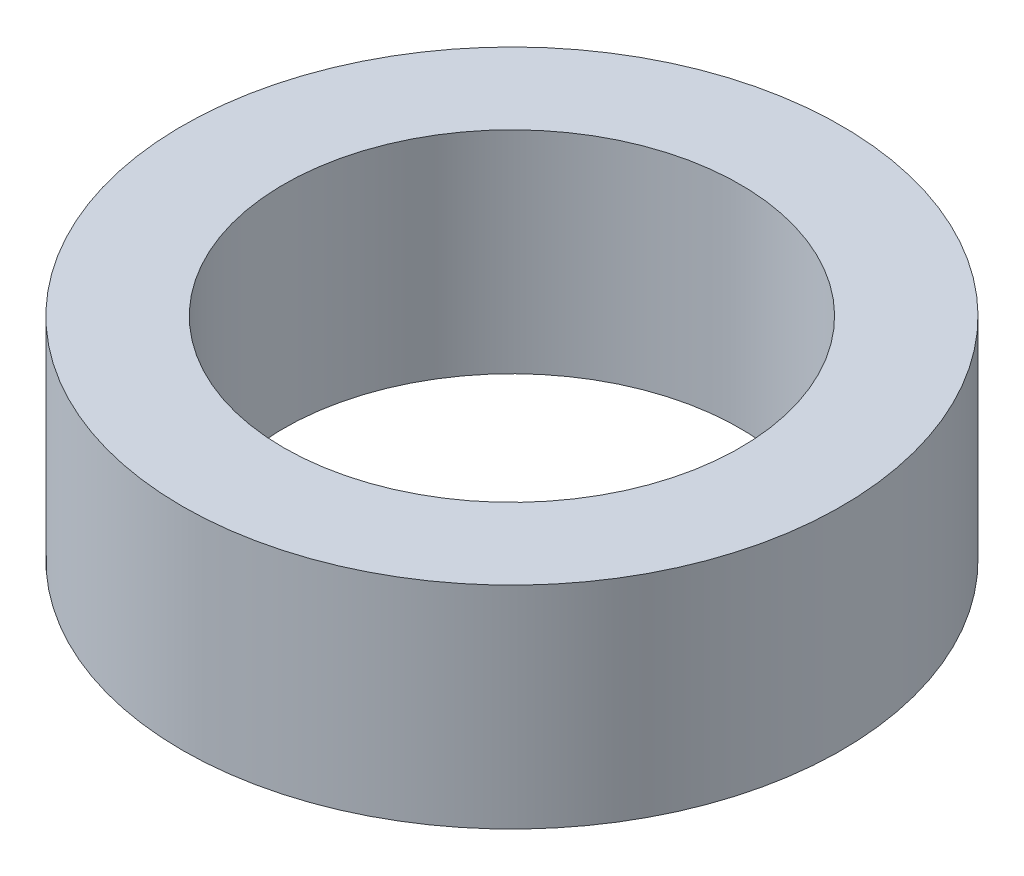
ISO-10303-21;
HEADER;
FILE_DESCRIPTION(('STEP AP214'),'2;1');
FILE_NAME('part.step','',(''),(''),'','','');
FILE_SCHEMA(('AUTOMOTIVE_DESIGN { 1 0 10303 214 1 1 1 1 }'));
ENDSEC;
DATA;
#1=APPLICATION_CONTEXT('core data for automotive mechanical design processes');
#2=APPLICATION_PROTOCOL_DEFINITION('international standard','automotive_design',2000,#1);
#3=PRODUCT_CONTEXT('',#1,'mechanical');
#4=PRODUCT('Part','Part','',(#3));
#5=PRODUCT_RELATED_PRODUCT_CATEGORY('part','',(#4));
#6=PRODUCT_DEFINITION_FORMATION('','',#4);
#7=PRODUCT_DEFINITION_CONTEXT('part definition',#1,'design');
#8=PRODUCT_DEFINITION('design','',#6,#7);
#9=PRODUCT_DEFINITION_SHAPE('','',#8);
#10=(LENGTH_UNIT() NAMED_UNIT(*) SI_UNIT(.MILLI.,.METRE.));
#11=(NAMED_UNIT(*) PLANE_ANGLE_UNIT() SI_UNIT($,.RADIAN.));
#12=(NAMED_UNIT(*) SI_UNIT($,.STERADIAN.) SOLID_ANGLE_UNIT());
#13=UNCERTAINTY_MEASURE_WITH_UNIT(LENGTH_MEASURE(1.E-05),#10,'distance_accuracy_value','');
#14=(GEOMETRIC_REPRESENTATION_CONTEXT(3) GLOBAL_UNCERTAINTY_ASSIGNED_CONTEXT((#13)) GLOBAL_UNIT_ASSIGNED_CONTEXT((#10,
#11,#12)) REPRESENTATION_CONTEXT('',''));
#15=CARTESIAN_POINT('',(0.,0.,0.));
#16=DIRECTION('',(0.,0.,1.));
#17=DIRECTION('',(1.,0.,0.));
#18=AXIS2_PLACEMENT_3D('',#15,#16,#17);
#19=CARTESIAN_POINT('',(0.,20.,0.));
#20=DIRECTION('',(0.,1.,0.));
#21=DIRECTION('',(0.,0.,1.));
#22=AXIS2_PLACEMENT_3D('',#19,#20,#21);
#23=PLANE('',#22);
#24=CARTESIAN_POINT('',(0.,20.,0.));
#25=DIRECTION('',(0.,1.,0.));
#26=DIRECTION('',(0.,0.,1.));
#27=AXIS2_PLACEMENT_3D('',#24,#25,#26);
#28=CIRCLE('',#27,31.2);
#29=CARTESIAN_POINT('',(0.,20.,31.2));
#30=VERTEX_POINT('',#29);
#31=EDGE_CURVE('E10',#30,#30,#28,.T.);
#32=ORIENTED_EDGE('',*,*,#31,.T.);
#33=EDGE_LOOP('',(#32));
#34=FACE_BOUND('',#33,.T.);
#35=CARTESIAN_POINT('',(0.,20.,0.));
#36=DIRECTION('',(0.,1.,0.));
#37=DIRECTION('',(0.,0.,1.));
#38=AXIS2_PLACEMENT_3D('',#35,#36,#37);
#39=CIRCLE('',#38,21.6);
#40=CARTESIAN_POINT('',(0.,20.,21.6));
#41=VERTEX_POINT('',#40);
#42=EDGE_CURVE('E50',#41,#41,#39,.T.);
#43=ORIENTED_EDGE('',*,*,#42,.F.);
#44=EDGE_LOOP('',(#43));
#45=FACE_BOUND('',#44,.T.);
#46=ADVANCED_FACE('F39',(#34,#45),#23,.T.);
#47=CARTESIAN_POINT('',(0.,0.,0.));
#48=DIRECTION('',(0.,1.,0.));
#49=DIRECTION('',(0.,0.,1.));
#50=AXIS2_PLACEMENT_3D('',#47,#48,#49);
#51=PLANE('',#50);
#52=CARTESIAN_POINT('',(0.,0.,0.));
#53=DIRECTION('',(0.,1.,0.));
#54=DIRECTION('',(0.,0.,1.));
#55=AXIS2_PLACEMENT_3D('',#52,#53,#54);
#56=CIRCLE('',#55,31.2);
#57=CARTESIAN_POINT('',(0.,0.,31.2));
#58=VERTEX_POINT('',#57);
#59=EDGE_CURVE('E43',#58,#58,#56,.T.);
#60=ORIENTED_EDGE('',*,*,#59,.F.);
#61=EDGE_LOOP('',(#60));
#62=FACE_BOUND('',#61,.T.);
#63=CARTESIAN_POINT('',(0.,0.,0.));
#64=DIRECTION('',(0.,1.,0.));
#65=DIRECTION('',(0.,0.,1.));
#66=AXIS2_PLACEMENT_3D('',#63,#64,#65);
#67=CIRCLE('',#66,21.6);
#68=CARTESIAN_POINT('',(0.,0.,21.6));
#69=VERTEX_POINT('',#68);
#70=EDGE_CURVE('E52',#69,#69,#67,.T.);
#71=ORIENTED_EDGE('',*,*,#70,.T.);
#72=EDGE_LOOP('',(#71));
#73=FACE_BOUND('',#72,.T.);
#74=ADVANCED_FACE('F62',(#62,#73),#51,.F.);
#75=CARTESIAN_POINT('',(0.,20.,0.));
#76=DIRECTION('',(0.,-1.,0.));
#77=DIRECTION('',(0.,0.,-1.));
#78=AXIS2_PLACEMENT_3D('',#75,#76,#77);
#79=CYLINDRICAL_SURFACE('',#78,31.2);
#80=ORIENTED_EDGE('',*,*,#31,.F.);
#81=EDGE_LOOP('',(#80));
#82=FACE_BOUND('',#81,.T.);
#83=ORIENTED_EDGE('',*,*,#59,.T.);
#84=EDGE_LOOP('',(#83));
#85=FACE_BOUND('',#84,.T.);
#86=ADVANCED_FACE('F41',(#82,#85),#79,.T.);
#87=CARTESIAN_POINT('',(0.,20.,0.));
#88=DIRECTION('',(0.,-1.,0.));
#89=DIRECTION('',(0.,0.,-1.));
#90=AXIS2_PLACEMENT_3D('',#87,#88,#89);
#91=CYLINDRICAL_SURFACE('',#90,21.6);
#92=ORIENTED_EDGE('',*,*,#42,.T.);
#93=EDGE_LOOP('',(#92));
#94=FACE_BOUND('',#93,.T.);
#95=ORIENTED_EDGE('',*,*,#70,.F.);
#96=EDGE_LOOP('',(#95));
#97=FACE_BOUND('',#96,.T.);
#98=ADVANCED_FACE('F58',(#94,#97),#91,.F.);
#99=CLOSED_SHELL('',(#46,#74,#86,#98));
#100=MANIFOLD_SOLID_BREP('B2',#99);
#101=ADVANCED_BREP_SHAPE_REPRESENTATION('',(#18,#100),#14);
#102=SHAPE_DEFINITION_REPRESENTATION(#9,#101);
ENDSEC;
END-ISO-10303-21;
